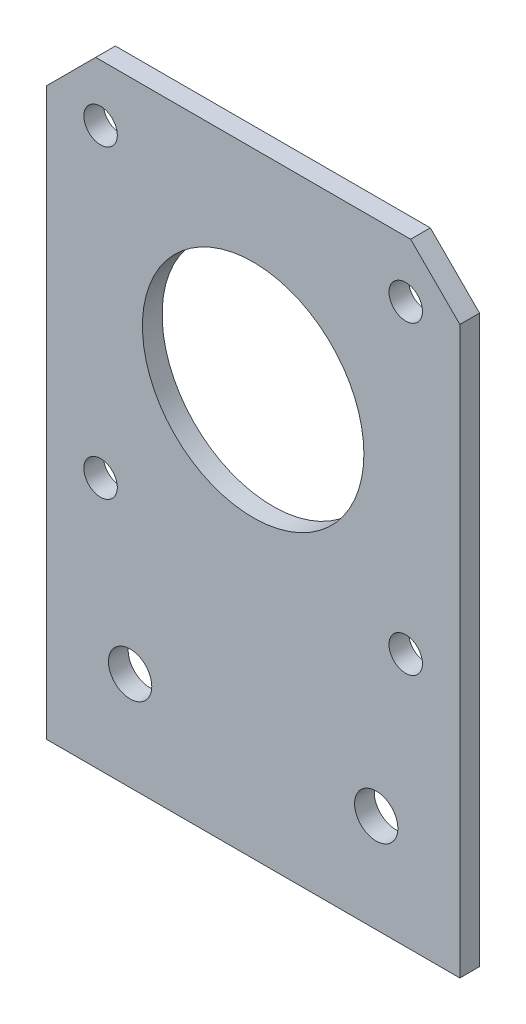
ISO-10303-21;
HEADER;
FILE_DESCRIPTION(('STEP AP214'),'2;1');
FILE_NAME('part.step','',(''),(''),'','','');
FILE_SCHEMA(('AUTOMOTIVE_DESIGN { 1 0 10303 214 1 1 1 1 }'));
ENDSEC;
DATA;
#1=APPLICATION_CONTEXT('core data for automotive mechanical design processes');
#2=APPLICATION_PROTOCOL_DEFINITION('international standard','automotive_design',2000,#1);
#3=PRODUCT_CONTEXT('',#1,'mechanical');
#4=PRODUCT('Part','Part','',(#3));
#5=PRODUCT_RELATED_PRODUCT_CATEGORY('part','',(#4));
#6=PRODUCT_DEFINITION_FORMATION('','',#4);
#7=PRODUCT_DEFINITION_CONTEXT('part definition',#1,'design');
#8=PRODUCT_DEFINITION('design','',#6,#7);
#9=PRODUCT_DEFINITION_SHAPE('','',#8);
#10=(LENGTH_UNIT() NAMED_UNIT(*) SI_UNIT(.MILLI.,.METRE.));
#11=(NAMED_UNIT(*) PLANE_ANGLE_UNIT() SI_UNIT($,.RADIAN.));
#12=(NAMED_UNIT(*) SI_UNIT($,.STERADIAN.) SOLID_ANGLE_UNIT());
#13=UNCERTAINTY_MEASURE_WITH_UNIT(LENGTH_MEASURE(1.E-05),#10,'distance_accuracy_value','');
#14=(GEOMETRIC_REPRESENTATION_CONTEXT(3) GLOBAL_UNCERTAINTY_ASSIGNED_CONTEXT((#13)) GLOBAL_UNIT_ASSIGNED_CONTEXT((#10,
#11,#12)) REPRESENTATION_CONTEXT('',''));
#15=CARTESIAN_POINT('',(0.,0.,0.));
#16=DIRECTION('',(0.,0.,1.));
#17=DIRECTION('',(1.,0.,0.));
#18=AXIS2_PLACEMENT_3D('',#15,#16,#17);
#19=CARTESIAN_POINT('',(0.,0.,1.));
#20=DIRECTION('',(0.,0.,1.));
#21=DIRECTION('',(1.,0.,0.));
#22=AXIS2_PLACEMENT_3D('',#19,#20,#21);
#23=PLANE('',#22);
#24=CARTESIAN_POINT('',(-12.5,-31.25,1.));
#25=DIRECTION('',(0.,0.,1.));
#26=DIRECTION('',(1.,0.,0.));
#27=AXIS2_PLACEMENT_3D('',#24,#25,#26);
#28=CIRCLE('',#27,2.2);
#29=CARTESIAN_POINT('',(-10.3,-31.25,1.));
#30=VERTEX_POINT('',#29);
#31=EDGE_CURVE('E196',#30,#30,#28,.T.);
#32=ORIENTED_EDGE('',*,*,#31,.F.);
#33=EDGE_LOOP('',(#32));
#34=FACE_BOUND('',#33,.T.);
#35=CARTESIAN_POINT('',(15.5,15.5,1.));
#36=DIRECTION('',(0.,0.,1.));
#37=DIRECTION('',(1.,0.,0.));
#38=AXIS2_PLACEMENT_3D('',#35,#36,#37);
#39=CIRCLE('',#38,1.7);
#40=CARTESIAN_POINT('',(17.2,15.5,1.));
#41=VERTEX_POINT('',#40);
#42=EDGE_CURVE('E208',#41,#41,#39,.T.);
#43=ORIENTED_EDGE('',*,*,#42,.F.);
#44=EDGE_LOOP('',(#43));
#45=FACE_BOUND('',#44,.T.);
#46=CARTESIAN_POINT('',(-15.5,-15.5,1.));
#47=DIRECTION('',(0.,0.,1.));
#48=DIRECTION('',(1.,0.,0.));
#49=AXIS2_PLACEMENT_3D('',#46,#47,#48);
#50=CIRCLE('',#49,1.7);
#51=CARTESIAN_POINT('',(-13.8,-15.5,1.));
#52=VERTEX_POINT('',#51);
#53=EDGE_CURVE('E220',#52,#52,#50,.T.);
#54=ORIENTED_EDGE('',*,*,#53,.F.);
#55=EDGE_LOOP('',(#54));
#56=FACE_BOUND('',#55,.T.);
#57=DIRECTION('',(-1.,0.,0.));
#58=VECTOR('',#57,1.);
#59=CARTESIAN_POINT('',(21.,21.25,1.));
#60=LINE('',#59,#58);
#61=CARTESIAN_POINT('',(16.,21.25,1.));
#62=VERTEX_POINT('',#61);
#63=CARTESIAN_POINT('',(-16.,21.25,1.));
#64=VERTEX_POINT('',#63);
#65=EDGE_CURVE('E98',#62,#64,#60,.T.);
#66=ORIENTED_EDGE('',*,*,#65,.T.);
#67=DIRECTION('',(0.707106781186549,0.707106781186546,0.));
#68=VECTOR('',#67,1.);
#69=CARTESIAN_POINT('',(-18.625,18.625,1.));
#70=LINE('',#69,#68);
#71=CARTESIAN_POINT('',(-21.,16.25,1.));
#72=VERTEX_POINT('',#71);
#73=EDGE_CURVE('E25',#64,#72,#70,.F.);
#74=ORIENTED_EDGE('',*,*,#73,.T.);
#75=DIRECTION('',(0.,-1.,0.));
#76=VECTOR('',#75,1.);
#77=CARTESIAN_POINT('',(-21.,-21.25,1.));
#78=LINE('',#77,#76);
#79=CARTESIAN_POINT('',(-21.,-41.25,1.));
#80=VERTEX_POINT('',#79);
#81=EDGE_CURVE('E71',#72,#80,#78,.T.);
#82=ORIENTED_EDGE('',*,*,#81,.T.);
#83=DIRECTION('',(1.,0.,0.));
#84=VECTOR('',#83,1.);
#85=CARTESIAN_POINT('',(-21.,-41.25,1.));
#86=LINE('',#85,#84);
#87=CARTESIAN_POINT('',(21.,-41.25,1.));
#88=VERTEX_POINT('',#87);
#89=EDGE_CURVE('E75',#80,#88,#86,.T.);
#90=ORIENTED_EDGE('',*,*,#89,.T.);
#91=DIRECTION('',(0.,1.,0.));
#92=VECTOR('',#91,1.);
#93=CARTESIAN_POINT('',(21.,-21.25,1.));
#94=LINE('',#93,#92);
#95=CARTESIAN_POINT('',(21.,16.25,1.));
#96=VERTEX_POINT('',#95);
#97=EDGE_CURVE('E96',#88,#96,#94,.T.);
#98=ORIENTED_EDGE('',*,*,#97,.T.);
#99=DIRECTION('',(0.707106781186546,-0.707106781186549,0.));
#100=VECTOR('',#99,1.);
#101=CARTESIAN_POINT('',(18.625,18.625,1.));
#102=LINE('',#101,#100);
#103=EDGE_CURVE('E120',#96,#62,#102,.F.);
#104=ORIENTED_EDGE('',*,*,#103,.T.);
#105=EDGE_LOOP('',(#66,#74,#82,#90,#98,#104));
#106=FACE_BOUND('',#105,.T.);
#107=CARTESIAN_POINT('',(0.,0.,1.));
#108=DIRECTION('',(0.,0.,1.));
#109=DIRECTION('',(1.,0.,0.));
#110=AXIS2_PLACEMENT_3D('',#107,#108,#109);
#111=CIRCLE('',#110,11.25);
#112=CARTESIAN_POINT('',(11.25,0.,1.));
#113=VERTEX_POINT('',#112);
#114=EDGE_CURVE('E105',#113,#113,#111,.T.);
#115=ORIENTED_EDGE('',*,*,#114,.F.);
#116=EDGE_LOOP('',(#115));
#117=FACE_BOUND('',#116,.T.);
#118=CARTESIAN_POINT('',(15.5,-15.5,1.));
#119=DIRECTION('',(0.,0.,1.));
#120=DIRECTION('',(1.,0.,0.));
#121=AXIS2_PLACEMENT_3D('',#118,#119,#120);
#122=CIRCLE('',#121,1.7);
#123=CARTESIAN_POINT('',(17.2,-15.5,1.));
#124=VERTEX_POINT('',#123);
#125=EDGE_CURVE('E214',#124,#124,#122,.T.);
#126=ORIENTED_EDGE('',*,*,#125,.F.);
#127=EDGE_LOOP('',(#126));
#128=FACE_BOUND('',#127,.T.);
#129=CARTESIAN_POINT('',(-15.5,15.5,1.));
#130=DIRECTION('',(0.,0.,1.));
#131=DIRECTION('',(1.,0.,0.));
#132=AXIS2_PLACEMENT_3D('',#129,#130,#131);
#133=CIRCLE('',#132,1.7);
#134=CARTESIAN_POINT('',(-13.8,15.5,1.));
#135=VERTEX_POINT('',#134);
#136=EDGE_CURVE('E202',#135,#135,#133,.T.);
#137=ORIENTED_EDGE('',*,*,#136,.F.);
#138=EDGE_LOOP('',(#137));
#139=FACE_BOUND('',#138,.T.);
#140=CARTESIAN_POINT('',(12.5,-31.25,1.));
#141=DIRECTION('',(0.,0.,1.));
#142=DIRECTION('',(1.,0.,0.));
#143=AXIS2_PLACEMENT_3D('',#140,#141,#142);
#144=CIRCLE('',#143,2.2);
#145=CARTESIAN_POINT('',(14.7,-31.25,1.));
#146=VERTEX_POINT('',#145);
#147=EDGE_CURVE('E187',#146,#146,#144,.T.);
#148=ORIENTED_EDGE('',*,*,#147,.F.);
#149=EDGE_LOOP('',(#148));
#150=FACE_BOUND('',#149,.T.);
#151=ADVANCED_FACE('F17',(#34,#45,#56,#106,#117,#128,#139,#150),#23,.T.);
#152=CARTESIAN_POINT('',(0.,0.,-1.));
#153=DIRECTION('',(0.,0.,1.));
#154=DIRECTION('',(1.,0.,0.));
#155=AXIS2_PLACEMENT_3D('',#152,#153,#154);
#156=PLANE('',#155);
#157=DIRECTION('',(0.,-1.,0.));
#158=VECTOR('',#157,1.);
#159=CARTESIAN_POINT('',(-21.,-21.25,-1.));
#160=LINE('',#159,#158);
#161=CARTESIAN_POINT('',(-21.,16.25,-1.));
#162=VERTEX_POINT('',#161);
#163=CARTESIAN_POINT('',(-21.,-41.25,-1.));
#164=VERTEX_POINT('',#163);
#165=EDGE_CURVE('E87',#162,#164,#160,.T.);
#166=ORIENTED_EDGE('',*,*,#165,.F.);
#167=DIRECTION('',(-0.707106781186549,-0.707106781186546,0.));
#168=VECTOR('',#167,1.);
#169=CARTESIAN_POINT('',(-21.,16.25,-1.));
#170=LINE('',#169,#168);
#171=CARTESIAN_POINT('',(-16.,21.25,-1.));
#172=VERTEX_POINT('',#171);
#173=EDGE_CURVE('E114',#162,#172,#170,.F.);
#174=ORIENTED_EDGE('',*,*,#173,.T.);
#175=DIRECTION('',(-1.,0.,0.));
#176=VECTOR('',#175,1.);
#177=CARTESIAN_POINT('',(21.,21.25,-1.));
#178=LINE('',#177,#176);
#179=CARTESIAN_POINT('',(16.,21.25,-1.));
#180=VERTEX_POINT('',#179);
#181=EDGE_CURVE('E81',#180,#172,#178,.T.);
#182=ORIENTED_EDGE('',*,*,#181,.F.);
#183=DIRECTION('',(-0.707106781186546,0.707106781186549,0.));
#184=VECTOR('',#183,1.);
#185=CARTESIAN_POINT('',(16.,21.25,-1.));
#186=LINE('',#185,#184);
#187=CARTESIAN_POINT('',(21.,16.25,-1.));
#188=VERTEX_POINT('',#187);
#189=EDGE_CURVE('E112',#180,#188,#186,.F.);
#190=ORIENTED_EDGE('',*,*,#189,.T.);
#191=DIRECTION('',(0.,1.,0.));
#192=VECTOR('',#191,1.);
#193=CARTESIAN_POINT('',(21.,-21.25,-1.));
#194=LINE('',#193,#192);
#195=CARTESIAN_POINT('',(21.,-41.25,-1.));
#196=VERTEX_POINT('',#195);
#197=EDGE_CURVE('E107',#196,#188,#194,.T.);
#198=ORIENTED_EDGE('',*,*,#197,.F.);
#199=DIRECTION('',(1.,0.,0.));
#200=VECTOR('',#199,1.);
#201=CARTESIAN_POINT('',(-21.,-41.25,-1.));
#202=LINE('',#201,#200);
#203=EDGE_CURVE('E104',#164,#196,#202,.T.);
#204=ORIENTED_EDGE('',*,*,#203,.F.);
#205=EDGE_LOOP('',(#166,#174,#182,#190,#198,#204));
#206=FACE_BOUND('',#205,.T.);
#207=CARTESIAN_POINT('',(0.,0.,-1.));
#208=DIRECTION('',(0.,0.,1.));
#209=DIRECTION('',(1.,0.,0.));
#210=AXIS2_PLACEMENT_3D('',#207,#208,#209);
#211=CIRCLE('',#210,11.25);
#212=CARTESIAN_POINT('',(11.25,0.,-1.));
#213=VERTEX_POINT('',#212);
#214=EDGE_CURVE('E223',#213,#213,#211,.T.);
#215=ORIENTED_EDGE('',*,*,#214,.T.);
#216=EDGE_LOOP('',(#215));
#217=FACE_BOUND('',#216,.T.);
#218=CARTESIAN_POINT('',(-15.5,-15.5,-1.));
#219=DIRECTION('',(0.,0.,1.));
#220=DIRECTION('',(1.,0.,0.));
#221=AXIS2_PLACEMENT_3D('',#218,#219,#220);
#222=CIRCLE('',#221,1.7);
#223=CARTESIAN_POINT('',(-13.8,-15.5,-1.));
#224=VERTEX_POINT('',#223);
#225=EDGE_CURVE('E217',#224,#224,#222,.T.);
#226=ORIENTED_EDGE('',*,*,#225,.T.);
#227=EDGE_LOOP('',(#226));
#228=FACE_BOUND('',#227,.T.);
#229=CARTESIAN_POINT('',(15.5,-15.5,-1.));
#230=DIRECTION('',(0.,0.,1.));
#231=DIRECTION('',(1.,0.,0.));
#232=AXIS2_PLACEMENT_3D('',#229,#230,#231);
#233=CIRCLE('',#232,1.7);
#234=CARTESIAN_POINT('',(17.2,-15.5,-1.));
#235=VERTEX_POINT('',#234);
#236=EDGE_CURVE('E211',#235,#235,#233,.T.);
#237=ORIENTED_EDGE('',*,*,#236,.T.);
#238=EDGE_LOOP('',(#237));
#239=FACE_BOUND('',#238,.T.);
#240=CARTESIAN_POINT('',(15.5,15.5,-1.));
#241=DIRECTION('',(0.,0.,1.));
#242=DIRECTION('',(1.,0.,0.));
#243=AXIS2_PLACEMENT_3D('',#240,#241,#242);
#244=CIRCLE('',#243,1.7);
#245=CARTESIAN_POINT('',(17.2,15.5,-1.));
#246=VERTEX_POINT('',#245);
#247=EDGE_CURVE('E205',#246,#246,#244,.T.);
#248=ORIENTED_EDGE('',*,*,#247,.T.);
#249=EDGE_LOOP('',(#248));
#250=FACE_BOUND('',#249,.T.);
#251=CARTESIAN_POINT('',(-15.5,15.5,-1.));
#252=DIRECTION('',(0.,0.,1.));
#253=DIRECTION('',(1.,0.,0.));
#254=AXIS2_PLACEMENT_3D('',#251,#252,#253);
#255=CIRCLE('',#254,1.7);
#256=CARTESIAN_POINT('',(-13.8,15.5,-1.));
#257=VERTEX_POINT('',#256);
#258=EDGE_CURVE('E199',#257,#257,#255,.T.);
#259=ORIENTED_EDGE('',*,*,#258,.T.);
#260=EDGE_LOOP('',(#259));
#261=FACE_BOUND('',#260,.T.);
#262=CARTESIAN_POINT('',(-12.5,-31.25,-1.));
#263=DIRECTION('',(0.,0.,1.));
#264=DIRECTION('',(1.,0.,0.));
#265=AXIS2_PLACEMENT_3D('',#262,#263,#264);
#266=CIRCLE('',#265,2.2);
#267=CARTESIAN_POINT('',(-10.3,-31.25,-1.));
#268=VERTEX_POINT('',#267);
#269=EDGE_CURVE('E193',#268,#268,#266,.T.);
#270=ORIENTED_EDGE('',*,*,#269,.T.);
#271=EDGE_LOOP('',(#270));
#272=FACE_BOUND('',#271,.T.);
#273=CARTESIAN_POINT('',(12.5,-31.25,-1.));
#274=DIRECTION('',(0.,0.,1.));
#275=DIRECTION('',(1.,0.,0.));
#276=AXIS2_PLACEMENT_3D('',#273,#274,#275);
#277=CIRCLE('',#276,2.2);
#278=CARTESIAN_POINT('',(14.7,-31.25,-1.));
#279=VERTEX_POINT('',#278);
#280=EDGE_CURVE('E190',#279,#279,#277,.T.);
#281=ORIENTED_EDGE('',*,*,#280,.T.);
#282=EDGE_LOOP('',(#281));
#283=FACE_BOUND('',#282,.T.);
#284=ADVANCED_FACE('F127',(#206,#217,#228,#239,#250,#261,#272,#283),#156,.F.);
#285=CARTESIAN_POINT('',(-21.,-21.25,1.));
#286=DIRECTION('',(1.,0.,0.));
#287=DIRECTION('',(0.,1.,0.));
#288=AXIS2_PLACEMENT_3D('',#285,#286,#287);
#289=PLANE('',#288);
#290=ORIENTED_EDGE('',*,*,#81,.F.);
#291=DIRECTION('',(0.,0.,-1.));
#292=VECTOR('',#291,1.);
#293=CARTESIAN_POINT('',(-21.,16.25,1.));
#294=LINE('',#293,#292);
#295=EDGE_CURVE('E91',#72,#162,#294,.T.);
#296=ORIENTED_EDGE('',*,*,#295,.T.);
#297=ORIENTED_EDGE('',*,*,#165,.T.);
#298=DIRECTION('',(0.,0.,-1.));
#299=VECTOR('',#298,1.);
#300=CARTESIAN_POINT('',(-21.,-41.25,1.));
#301=LINE('',#300,#299);
#302=EDGE_CURVE('E84',#80,#164,#301,.T.);
#303=ORIENTED_EDGE('',*,*,#302,.F.);
#304=EDGE_LOOP('',(#290,#296,#297,#303));
#305=FACE_BOUND('',#304,.T.);
#306=ADVANCED_FACE('F85',(#305),#289,.F.);
#307=CARTESIAN_POINT('',(-21.,-41.25,1.));
#308=DIRECTION('',(0.,1.,0.));
#309=DIRECTION('',(0.,0.,1.));
#310=AXIS2_PLACEMENT_3D('',#307,#308,#309);
#311=PLANE('',#310);
#312=ORIENTED_EDGE('',*,*,#203,.T.);
#313=DIRECTION('',(0.,0.,-1.));
#314=VECTOR('',#313,1.);
#315=CARTESIAN_POINT('',(21.,-41.25,1.));
#316=LINE('',#315,#314);
#317=EDGE_CURVE('E92',#88,#196,#316,.T.);
#318=ORIENTED_EDGE('',*,*,#317,.F.);
#319=ORIENTED_EDGE('',*,*,#89,.F.);
#320=ORIENTED_EDGE('',*,*,#302,.T.);
#321=EDGE_LOOP('',(#312,#318,#319,#320));
#322=FACE_BOUND('',#321,.T.);
#323=ADVANCED_FACE('F94',(#322),#311,.F.);
#324=CARTESIAN_POINT('',(21.,-21.25,1.));
#325=DIRECTION('',(-1.,0.,0.));
#326=DIRECTION('',(0.,0.,1.));
#327=AXIS2_PLACEMENT_3D('',#324,#325,#326);
#328=PLANE('',#327);
#329=ORIENTED_EDGE('',*,*,#197,.T.);
#330=DIRECTION('',(0.,0.,1.));
#331=VECTOR('',#330,1.);
#332=CARTESIAN_POINT('',(21.,16.25,1.));
#333=LINE('',#332,#331);
#334=EDGE_CURVE('E11',#188,#96,#333,.T.);
#335=ORIENTED_EDGE('',*,*,#334,.T.);
#336=ORIENTED_EDGE('',*,*,#97,.F.);
#337=ORIENTED_EDGE('',*,*,#317,.T.);
#338=EDGE_LOOP('',(#329,#335,#336,#337));
#339=FACE_BOUND('',#338,.T.);
#340=ADVANCED_FACE('F129',(#339),#328,.F.);
#341=CARTESIAN_POINT('',(21.,21.25,1.));
#342=DIRECTION('',(0.,-1.,0.));
#343=DIRECTION('',(1.,0.,0.));
#344=AXIS2_PLACEMENT_3D('',#341,#342,#343);
#345=PLANE('',#344);
#346=ORIENTED_EDGE('',*,*,#181,.T.);
#347=DIRECTION('',(0.,0.,1.));
#348=VECTOR('',#347,1.);
#349=CARTESIAN_POINT('',(-16.,21.25,1.));
#350=LINE('',#349,#348);
#351=EDGE_CURVE('E38',#172,#64,#350,.T.);
#352=ORIENTED_EDGE('',*,*,#351,.T.);
#353=ORIENTED_EDGE('',*,*,#65,.F.);
#354=DIRECTION('',(0.,0.,-1.));
#355=VECTOR('',#354,1.);
#356=CARTESIAN_POINT('',(16.,21.25,1.));
#357=LINE('',#356,#355);
#358=EDGE_CURVE('E116',#62,#180,#357,.T.);
#359=ORIENTED_EDGE('',*,*,#358,.T.);
#360=EDGE_LOOP('',(#346,#352,#353,#359));
#361=FACE_BOUND('',#360,.T.);
#362=ADVANCED_FACE('F124',(#361),#345,.F.);
#363=CARTESIAN_POINT('',(0.,0.,1.));
#364=DIRECTION('',(0.,0.,-1.));
#365=DIRECTION('',(-1.,0.,0.));
#366=AXIS2_PLACEMENT_3D('',#363,#364,#365);
#367=CYLINDRICAL_SURFACE('',#366,11.25);
#368=ORIENTED_EDGE('',*,*,#114,.T.);
#369=EDGE_LOOP('',(#368));
#370=FACE_BOUND('',#369,.T.);
#371=ORIENTED_EDGE('',*,*,#214,.F.);
#372=EDGE_LOOP('',(#371));
#373=FACE_BOUND('',#372,.T.);
#374=ADVANCED_FACE('F138',(#370,#373),#367,.F.);
#375=CARTESIAN_POINT('',(-15.5,-15.5,1.));
#376=DIRECTION('',(0.,0.,-1.));
#377=DIRECTION('',(-1.,0.,0.));
#378=AXIS2_PLACEMENT_3D('',#375,#376,#377);
#379=CYLINDRICAL_SURFACE('',#378,1.7);
#380=ORIENTED_EDGE('',*,*,#53,.T.);
#381=EDGE_LOOP('',(#380));
#382=FACE_BOUND('',#381,.T.);
#383=ORIENTED_EDGE('',*,*,#225,.F.);
#384=EDGE_LOOP('',(#383));
#385=FACE_BOUND('',#384,.T.);
#386=ADVANCED_FACE('F154',(#382,#385),#379,.F.);
#387=CARTESIAN_POINT('',(15.5,-15.5,1.));
#388=DIRECTION('',(0.,0.,-1.));
#389=DIRECTION('',(-1.,0.,0.));
#390=AXIS2_PLACEMENT_3D('',#387,#388,#389);
#391=CYLINDRICAL_SURFACE('',#390,1.7);
#392=ORIENTED_EDGE('',*,*,#125,.T.);
#393=EDGE_LOOP('',(#392));
#394=FACE_BOUND('',#393,.T.);
#395=ORIENTED_EDGE('',*,*,#236,.F.);
#396=EDGE_LOOP('',(#395));
#397=FACE_BOUND('',#396,.T.);
#398=ADVANCED_FACE('F158',(#394,#397),#391,.F.);
#399=CARTESIAN_POINT('',(15.5,15.5,1.));
#400=DIRECTION('',(0.,0.,-1.));
#401=DIRECTION('',(-1.,0.,0.));
#402=AXIS2_PLACEMENT_3D('',#399,#400,#401);
#403=CYLINDRICAL_SURFACE('',#402,1.7);
#404=ORIENTED_EDGE('',*,*,#42,.T.);
#405=EDGE_LOOP('',(#404));
#406=FACE_BOUND('',#405,.T.);
#407=ORIENTED_EDGE('',*,*,#247,.F.);
#408=EDGE_LOOP('',(#407));
#409=FACE_BOUND('',#408,.T.);
#410=ADVANCED_FACE('F162',(#406,#409),#403,.F.);
#411=CARTESIAN_POINT('',(-15.5,15.5,1.));
#412=DIRECTION('',(0.,0.,-1.));
#413=DIRECTION('',(-1.,0.,0.));
#414=AXIS2_PLACEMENT_3D('',#411,#412,#413);
#415=CYLINDRICAL_SURFACE('',#414,1.7);
#416=ORIENTED_EDGE('',*,*,#136,.T.);
#417=EDGE_LOOP('',(#416));
#418=FACE_BOUND('',#417,.T.);
#419=ORIENTED_EDGE('',*,*,#258,.F.);
#420=EDGE_LOOP('',(#419));
#421=FACE_BOUND('',#420,.T.);
#422=ADVANCED_FACE('F166',(#418,#421),#415,.F.);
#423=CARTESIAN_POINT('',(-12.5,-31.25,1.));
#424=DIRECTION('',(0.,0.,-1.));
#425=DIRECTION('',(-1.,0.,0.));
#426=AXIS2_PLACEMENT_3D('',#423,#424,#425);
#427=CYLINDRICAL_SURFACE('',#426,2.2);
#428=ORIENTED_EDGE('',*,*,#31,.T.);
#429=EDGE_LOOP('',(#428));
#430=FACE_BOUND('',#429,.T.);
#431=ORIENTED_EDGE('',*,*,#269,.F.);
#432=EDGE_LOOP('',(#431));
#433=FACE_BOUND('',#432,.T.);
#434=ADVANCED_FACE('F170',(#430,#433),#427,.F.);
#435=CARTESIAN_POINT('',(12.5,-31.25,1.));
#436=DIRECTION('',(0.,0.,-1.));
#437=DIRECTION('',(-1.,0.,0.));
#438=AXIS2_PLACEMENT_3D('',#435,#436,#437);
#439=CYLINDRICAL_SURFACE('',#438,2.2);
#440=ORIENTED_EDGE('',*,*,#147,.T.);
#441=EDGE_LOOP('',(#440));
#442=FACE_BOUND('',#441,.T.);
#443=ORIENTED_EDGE('',*,*,#280,.F.);
#444=EDGE_LOOP('',(#443));
#445=FACE_BOUND('',#444,.T.);
#446=ADVANCED_FACE('F174',(#442,#445),#439,.F.);
#447=CARTESIAN_POINT('',(-21.,16.25,1.));
#448=DIRECTION('',(0.707106781186546,-0.707106781186549,0.));
#449=DIRECTION('',(0.,0.,-1.));
#450=AXIS2_PLACEMENT_3D('',#447,#448,#449);
#451=PLANE('',#450);
#452=ORIENTED_EDGE('',*,*,#73,.F.);
#453=ORIENTED_EDGE('',*,*,#351,.F.);
#454=ORIENTED_EDGE('',*,*,#173,.F.);
#455=ORIENTED_EDGE('',*,*,#295,.F.);
#456=EDGE_LOOP('',(#452,#453,#454,#455));
#457=FACE_BOUND('',#456,.T.);
#458=ADVANCED_FACE('F177',(#457),#451,.F.);
#459=CARTESIAN_POINT('',(16.,21.25,1.));
#460=DIRECTION('',(-0.707106781186549,-0.707106781186546,0.));
#461=DIRECTION('',(0.,0.,-1.));
#462=AXIS2_PLACEMENT_3D('',#459,#460,#461);
#463=PLANE('',#462);
#464=ORIENTED_EDGE('',*,*,#103,.F.);
#465=ORIENTED_EDGE('',*,*,#334,.F.);
#466=ORIENTED_EDGE('',*,*,#189,.F.);
#467=ORIENTED_EDGE('',*,*,#358,.F.);
#468=EDGE_LOOP('',(#464,#465,#466,#467));
#469=FACE_BOUND('',#468,.T.);
#470=ADVANCED_FACE('F19',(#469),#463,.F.);
#471=CLOSED_SHELL('',(#151,#284,#306,#323,#340,#362,#374,#386,#398,#410,#422,#434,#446,#458,#470));
#472=MANIFOLD_SOLID_BREP('B1',#471);
#473=ADVANCED_BREP_SHAPE_REPRESENTATION('',(#18,#472),#14);
#474=SHAPE_DEFINITION_REPRESENTATION(#9,#473);
ENDSEC;
END-ISO-10303-21;
